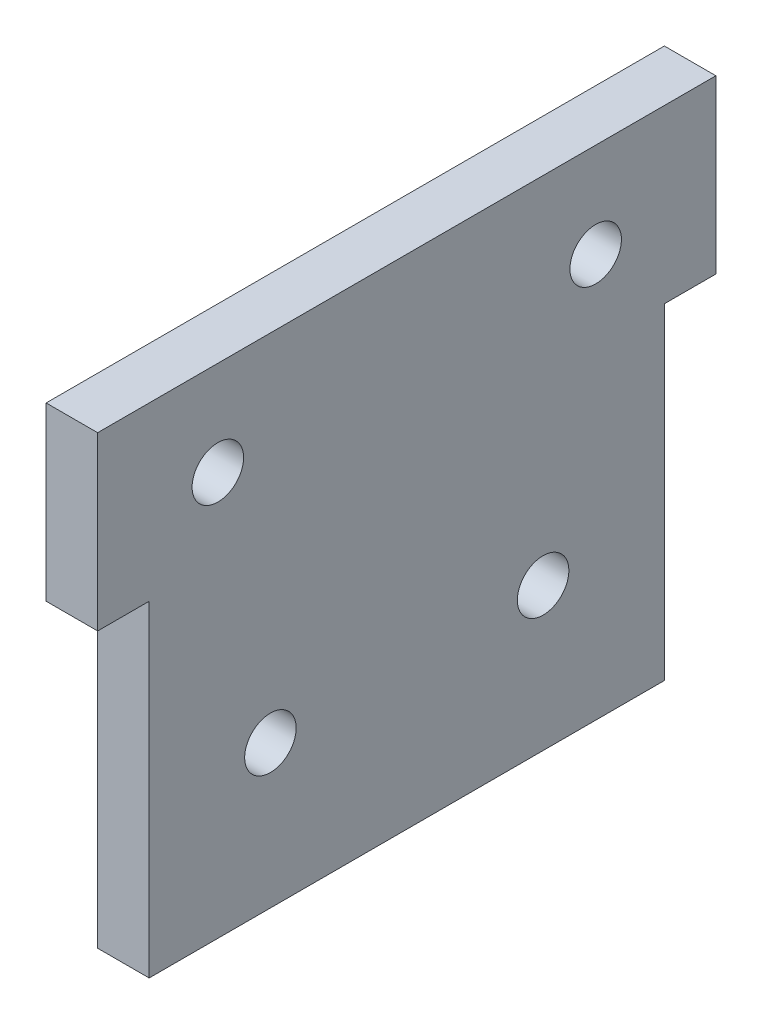
ISO-10303-21;
HEADER;
FILE_DESCRIPTION(('STEP AP214'),'2;1');
FILE_NAME('part.step','',(''),(''),'','','');
FILE_SCHEMA(('AUTOMOTIVE_DESIGN { 1 0 10303 214 1 1 1 1 }'));
ENDSEC;
DATA;
#1=APPLICATION_CONTEXT('core data for automotive mechanical design processes');
#2=APPLICATION_PROTOCOL_DEFINITION('international standard','automotive_design',2000,#1);
#3=PRODUCT_CONTEXT('',#1,'mechanical');
#4=PRODUCT('Part','Part','',(#3));
#5=PRODUCT_RELATED_PRODUCT_CATEGORY('part','',(#4));
#6=PRODUCT_DEFINITION_FORMATION('','',#4);
#7=PRODUCT_DEFINITION_CONTEXT('part definition',#1,'design');
#8=PRODUCT_DEFINITION('design','',#6,#7);
#9=PRODUCT_DEFINITION_SHAPE('','',#8);
#10=(LENGTH_UNIT() NAMED_UNIT(*) SI_UNIT(.MILLI.,.METRE.));
#11=(NAMED_UNIT(*) PLANE_ANGLE_UNIT() SI_UNIT($,.RADIAN.));
#12=(NAMED_UNIT(*) SI_UNIT($,.STERADIAN.) SOLID_ANGLE_UNIT());
#13=UNCERTAINTY_MEASURE_WITH_UNIT(LENGTH_MEASURE(1.E-05),#10,'distance_accuracy_value','');
#14=(GEOMETRIC_REPRESENTATION_CONTEXT(3) GLOBAL_UNCERTAINTY_ASSIGNED_CONTEXT((#13)) GLOBAL_UNIT_ASSIGNED_CONTEXT((#10,
#11,#12)) REPRESENTATION_CONTEXT('',''));
#15=CARTESIAN_POINT('',(0.,0.,0.));
#16=DIRECTION('',(0.,0.,1.));
#17=DIRECTION('',(1.,0.,0.));
#18=AXIS2_PLACEMENT_3D('',#15,#16,#17);
#19=CARTESIAN_POINT('',(3.,0.,0.));
#20=DIRECTION('',(-1.,0.,0.));
#21=DIRECTION('',(0.,0.,1.));
#22=AXIS2_PLACEMENT_3D('',#19,#20,#21);
#23=PLANE('',#22);
#24=DIRECTION('',(0.,0.,1.));
#25=VECTOR('',#24,1.);
#26=CARTESIAN_POINT('',(3.,32.2893221036416,-18.));
#27=LINE('',#26,#25);
#28=CARTESIAN_POINT('',(3.,32.2893221036416,-18.));
#29=VERTEX_POINT('',#28);
#30=CARTESIAN_POINT('',(3.,32.2893221036416,18.));
#31=VERTEX_POINT('',#30);
#32=EDGE_CURVE('E92',#29,#31,#27,.T.);
#33=ORIENTED_EDGE('',*,*,#32,.T.);
#34=DIRECTION('',(0.,-1.,0.));
#35=VECTOR('',#34,1.);
#36=CARTESIAN_POINT('',(3.,22.2893221036416,18.));
#37=LINE('',#36,#35);
#38=CARTESIAN_POINT('',(3.,22.2893221036416,18.));
#39=VERTEX_POINT('',#38);
#40=EDGE_CURVE('E177',#31,#39,#37,.T.);
#41=ORIENTED_EDGE('',*,*,#40,.T.);
#42=DIRECTION('',(0.,0.,-1.));
#43=VECTOR('',#42,1.);
#44=CARTESIAN_POINT('',(3.,22.2893221036416,18.));
#45=LINE('',#44,#43);
#46=CARTESIAN_POINT('',(3.,22.2893221036416,15.));
#47=VERTEX_POINT('',#46);
#48=EDGE_CURVE('E160',#39,#47,#45,.T.);
#49=ORIENTED_EDGE('',*,*,#48,.T.);
#50=DIRECTION('',(0.,-1.,0.));
#51=VECTOR('',#50,1.);
#52=CARTESIAN_POINT('',(3.,3.28932210364157,15.));
#53=LINE('',#52,#51);
#54=CARTESIAN_POINT('',(3.,3.28932210364157,15.));
#55=VERTEX_POINT('',#54);
#56=EDGE_CURVE('E173',#47,#55,#53,.T.);
#57=ORIENTED_EDGE('',*,*,#56,.T.);
#58=DIRECTION('',(0.,0.,-1.));
#59=VECTOR('',#58,1.);
#60=CARTESIAN_POINT('',(3.,3.28932210364158,-15.));
#61=LINE('',#60,#59);
#62=CARTESIAN_POINT('',(3.,3.28932210364158,-15.));
#63=VERTEX_POINT('',#62);
#64=EDGE_CURVE('E112',#55,#63,#61,.T.);
#65=ORIENTED_EDGE('',*,*,#64,.T.);
#66=DIRECTION('',(0.,1.,0.));
#67=VECTOR('',#66,1.);
#68=CARTESIAN_POINT('',(3.,3.28932210364158,-15.));
#69=LINE('',#68,#67);
#70=CARTESIAN_POINT('',(3.,22.2893221036416,-15.));
#71=VERTEX_POINT('',#70);
#72=EDGE_CURVE('E106',#63,#71,#69,.T.);
#73=ORIENTED_EDGE('',*,*,#72,.T.);
#74=DIRECTION('',(0.,0.,-1.));
#75=VECTOR('',#74,1.);
#76=CARTESIAN_POINT('',(3.,22.2893221036416,-18.));
#77=LINE('',#76,#75);
#78=CARTESIAN_POINT('',(3.,22.2893221036416,-18.));
#79=VERTEX_POINT('',#78);
#80=EDGE_CURVE('E110',#71,#79,#77,.T.);
#81=ORIENTED_EDGE('',*,*,#80,.T.);
#82=DIRECTION('',(0.,1.,0.));
#83=VECTOR('',#82,1.);
#84=CARTESIAN_POINT('',(3.,22.2893221036416,-18.));
#85=LINE('',#84,#83);
#86=EDGE_CURVE('E50',#79,#29,#85,.T.);
#87=ORIENTED_EDGE('',*,*,#86,.T.);
#88=EDGE_LOOP('',(#33,#41,#49,#57,#65,#73,#81,#87));
#89=FACE_BOUND('',#88,.T.);
#90=CARTESIAN_POINT('',(3.,11.6193221036416,-7.94));
#91=DIRECTION('',(1.,0.,0.));
#92=DIRECTION('',(0.,0.,-1.));
#93=AXIS2_PLACEMENT_3D('',#90,#91,#92);
#94=CIRCLE('',#93,1.5);
#95=CARTESIAN_POINT('',(3.,11.6193221036416,-9.44));
#96=VERTEX_POINT('',#95);
#97=EDGE_CURVE('E132',#96,#96,#94,.T.);
#98=ORIENTED_EDGE('',*,*,#97,.F.);
#99=EDGE_LOOP('',(#98));
#100=FACE_BOUND('',#99,.T.);
#101=CARTESIAN_POINT('',(3.,11.6193221036416,7.93999999999999));
#102=DIRECTION('',(1.,0.,0.));
#103=DIRECTION('',(0.,0.,1.));
#104=AXIS2_PLACEMENT_3D('',#101,#102,#103);
#105=CIRCLE('',#104,1.5);
#106=CARTESIAN_POINT('',(3.,11.6193221036416,9.43999999999999));
#107=VERTEX_POINT('',#106);
#108=EDGE_CURVE('E183',#107,#107,#105,.T.);
#109=ORIENTED_EDGE('',*,*,#108,.F.);
#110=EDGE_LOOP('',(#109));
#111=FACE_BOUND('',#110,.T.);
#112=CARTESIAN_POINT('',(3.,26.7893221036416,-11.));
#113=DIRECTION('',(1.,0.,0.));
#114=DIRECTION('',(0.,0.,-1.));
#115=AXIS2_PLACEMENT_3D('',#112,#113,#114);
#116=CIRCLE('',#115,1.5);
#117=CARTESIAN_POINT('',(3.,26.7893221036416,-12.5));
#118=VERTEX_POINT('',#117);
#119=EDGE_CURVE('E189',#118,#118,#116,.T.);
#120=ORIENTED_EDGE('',*,*,#119,.F.);
#121=EDGE_LOOP('',(#120));
#122=FACE_BOUND('',#121,.T.);
#123=CARTESIAN_POINT('',(3.,26.7893221036416,11.));
#124=DIRECTION('',(1.,0.,0.));
#125=DIRECTION('',(0.,0.,1.));
#126=AXIS2_PLACEMENT_3D('',#123,#124,#125);
#127=CIRCLE('',#126,1.5);
#128=CARTESIAN_POINT('',(3.,26.7893221036416,12.5));
#129=VERTEX_POINT('',#128);
#130=EDGE_CURVE('E195',#129,#129,#127,.T.);
#131=ORIENTED_EDGE('',*,*,#130,.F.);
#132=EDGE_LOOP('',(#131));
#133=FACE_BOUND('',#132,.T.);
#134=ADVANCED_FACE('F33',(#89,#100,#111,#122,#133),#23,.F.);
#135=CARTESIAN_POINT('',(0.,0.,0.));
#136=DIRECTION('',(-1.,0.,0.));
#137=DIRECTION('',(0.,0.,1.));
#138=AXIS2_PLACEMENT_3D('',#135,#136,#137);
#139=PLANE('',#138);
#140=CARTESIAN_POINT('',(0.,26.7893221036416,-11.));
#141=DIRECTION('',(1.,0.,0.));
#142=DIRECTION('',(0.,0.,-1.));
#143=AXIS2_PLACEMENT_3D('',#140,#141,#142);
#144=CIRCLE('',#143,1.5);
#145=CARTESIAN_POINT('',(0.,26.7893221036416,-12.5));
#146=VERTEX_POINT('',#145);
#147=EDGE_CURVE('E192',#146,#146,#144,.T.);
#148=ORIENTED_EDGE('',*,*,#147,.T.);
#149=EDGE_LOOP('',(#148));
#150=FACE_BOUND('',#149,.T.);
#151=CARTESIAN_POINT('',(0.,11.6193221036416,-7.94));
#152=DIRECTION('',(1.,0.,0.));
#153=DIRECTION('',(0.,0.,-1.));
#154=AXIS2_PLACEMENT_3D('',#151,#152,#153);
#155=CIRCLE('',#154,1.5);
#156=CARTESIAN_POINT('',(0.,11.6193221036416,-9.44));
#157=VERTEX_POINT('',#156);
#158=EDGE_CURVE('E180',#157,#157,#155,.T.);
#159=ORIENTED_EDGE('',*,*,#158,.T.);
#160=EDGE_LOOP('',(#159));
#161=FACE_BOUND('',#160,.T.);
#162=DIRECTION('',(0.,0.,1.));
#163=VECTOR('',#162,1.);
#164=CARTESIAN_POINT('',(0.,32.2893221036416,18.));
#165=LINE('',#164,#163);
#166=CARTESIAN_POINT('',(0.,32.2893221036416,-18.));
#167=VERTEX_POINT('',#166);
#168=CARTESIAN_POINT('',(0.,32.2893221036416,18.));
#169=VERTEX_POINT('',#168);
#170=EDGE_CURVE('E86',#167,#169,#165,.T.);
#171=ORIENTED_EDGE('',*,*,#170,.F.);
#172=DIRECTION('',(0.,1.,0.));
#173=VECTOR('',#172,1.);
#174=CARTESIAN_POINT('',(0.,22.2893221036416,-18.));
#175=LINE('',#174,#173);
#176=CARTESIAN_POINT('',(0.,22.2893221036416,-18.));
#177=VERTEX_POINT('',#176);
#178=EDGE_CURVE('E142',#177,#167,#175,.T.);
#179=ORIENTED_EDGE('',*,*,#178,.F.);
#180=DIRECTION('',(0.,0.,-1.));
#181=VECTOR('',#180,1.);
#182=CARTESIAN_POINT('',(0.,22.2893221036416,-18.));
#183=LINE('',#182,#181);
#184=CARTESIAN_POINT('',(0.,22.2893221036416,-15.));
#185=VERTEX_POINT('',#184);
#186=EDGE_CURVE('E79',#185,#177,#183,.T.);
#187=ORIENTED_EDGE('',*,*,#186,.F.);
#188=DIRECTION('',(0.,1.,0.));
#189=VECTOR('',#188,1.);
#190=CARTESIAN_POINT('',(0.,3.28932210364158,-15.));
#191=LINE('',#190,#189);
#192=CARTESIAN_POINT('',(0.,3.28932210364158,-15.));
#193=VERTEX_POINT('',#192);
#194=EDGE_CURVE('E120',#193,#185,#191,.T.);
#195=ORIENTED_EDGE('',*,*,#194,.F.);
#196=DIRECTION('',(0.,0.,-1.));
#197=VECTOR('',#196,1.);
#198=CARTESIAN_POINT('',(0.,3.28932210364158,-15.));
#199=LINE('',#198,#197);
#200=CARTESIAN_POINT('',(0.,3.28932210364157,15.));
#201=VERTEX_POINT('',#200);
#202=EDGE_CURVE('E138',#201,#193,#199,.T.);
#203=ORIENTED_EDGE('',*,*,#202,.F.);
#204=DIRECTION('',(0.,-1.,0.));
#205=VECTOR('',#204,1.);
#206=CARTESIAN_POINT('',(0.,3.28932210364157,15.));
#207=LINE('',#206,#205);
#208=CARTESIAN_POINT('',(0.,22.2893221036416,15.));
#209=VERTEX_POINT('',#208);
#210=EDGE_CURVE('E136',#209,#201,#207,.T.);
#211=ORIENTED_EDGE('',*,*,#210,.F.);
#212=DIRECTION('',(0.,0.,-1.));
#213=VECTOR('',#212,1.);
#214=CARTESIAN_POINT('',(0.,22.2893221036416,18.));
#215=LINE('',#214,#213);
#216=CARTESIAN_POINT('',(0.,22.2893221036416,18.));
#217=VERTEX_POINT('',#216);
#218=EDGE_CURVE('E134',#217,#209,#215,.T.);
#219=ORIENTED_EDGE('',*,*,#218,.F.);
#220=DIRECTION('',(0.,-1.,0.));
#221=VECTOR('',#220,1.);
#222=CARTESIAN_POINT('',(0.,22.2893221036416,18.));
#223=LINE('',#222,#221);
#224=EDGE_CURVE('E131',#169,#217,#223,.T.);
#225=ORIENTED_EDGE('',*,*,#224,.F.);
#226=EDGE_LOOP('',(#171,#179,#187,#195,#203,#211,#219,#225));
#227=FACE_BOUND('',#226,.T.);
#228=CARTESIAN_POINT('',(0.,11.6193221036416,7.93999999999999));
#229=DIRECTION('',(1.,0.,0.));
#230=DIRECTION('',(0.,0.,1.));
#231=AXIS2_PLACEMENT_3D('',#228,#229,#230);
#232=CIRCLE('',#231,1.5);
#233=CARTESIAN_POINT('',(0.,11.6193221036416,9.43999999999999));
#234=VERTEX_POINT('',#233);
#235=EDGE_CURVE('E186',#234,#234,#232,.T.);
#236=ORIENTED_EDGE('',*,*,#235,.T.);
#237=EDGE_LOOP('',(#236));
#238=FACE_BOUND('',#237,.T.);
#239=CARTESIAN_POINT('',(0.,26.7893221036416,11.));
#240=DIRECTION('',(1.,0.,0.));
#241=DIRECTION('',(0.,0.,1.));
#242=AXIS2_PLACEMENT_3D('',#239,#240,#241);
#243=CIRCLE('',#242,1.5);
#244=CARTESIAN_POINT('',(0.,26.7893221036416,12.5));
#245=VERTEX_POINT('',#244);
#246=EDGE_CURVE('E198',#245,#245,#243,.T.);
#247=ORIENTED_EDGE('',*,*,#246,.T.);
#248=EDGE_LOOP('',(#247));
#249=FACE_BOUND('',#248,.T.);
#250=ADVANCED_FACE('F164',(#150,#161,#227,#238,#249),#139,.T.);
#251=CARTESIAN_POINT('',(3.,32.2893221036416,18.));
#252=DIRECTION('',(0.,-1.,0.));
#253=DIRECTION('',(0.,0.,-1.));
#254=AXIS2_PLACEMENT_3D('',#251,#252,#253);
#255=PLANE('',#254);
#256=ORIENTED_EDGE('',*,*,#170,.T.);
#257=DIRECTION('',(-1.,0.,0.));
#258=VECTOR('',#257,1.);
#259=CARTESIAN_POINT('',(3.,32.2893221036416,18.));
#260=LINE('',#259,#258);
#261=EDGE_CURVE('E11',#31,#169,#260,.T.);
#262=ORIENTED_EDGE('',*,*,#261,.F.);
#263=ORIENTED_EDGE('',*,*,#32,.F.);
#264=DIRECTION('',(-1.,0.,0.));
#265=VECTOR('',#264,1.);
#266=CARTESIAN_POINT('',(3.,32.2893221036416,-18.));
#267=LINE('',#266,#265);
#268=EDGE_CURVE('E126',#29,#167,#267,.T.);
#269=ORIENTED_EDGE('',*,*,#268,.T.);
#270=EDGE_LOOP('',(#256,#262,#263,#269));
#271=FACE_BOUND('',#270,.T.);
#272=ADVANCED_FACE('F35',(#271),#255,.F.);
#273=CARTESIAN_POINT('',(3.,22.2893221036416,18.));
#274=DIRECTION('',(0.,0.,-1.));
#275=DIRECTION('',(-1.,0.,0.));
#276=AXIS2_PLACEMENT_3D('',#273,#274,#275);
#277=PLANE('',#276);
#278=ORIENTED_EDGE('',*,*,#224,.T.);
#279=DIRECTION('',(-1.,0.,0.));
#280=VECTOR('',#279,1.);
#281=CARTESIAN_POINT('',(3.,22.2893221036416,18.));
#282=LINE('',#281,#280);
#283=EDGE_CURVE('E42',#39,#217,#282,.T.);
#284=ORIENTED_EDGE('',*,*,#283,.F.);
#285=ORIENTED_EDGE('',*,*,#40,.F.);
#286=ORIENTED_EDGE('',*,*,#261,.T.);
#287=EDGE_LOOP('',(#278,#284,#285,#286));
#288=FACE_BOUND('',#287,.T.);
#289=ADVANCED_FACE('F231',(#288),#277,.F.);
#290=CARTESIAN_POINT('',(3.,22.2893221036416,18.));
#291=DIRECTION('',(0.,1.,0.));
#292=DIRECTION('',(0.,0.,1.));
#293=AXIS2_PLACEMENT_3D('',#290,#291,#292);
#294=PLANE('',#293);
#295=ORIENTED_EDGE('',*,*,#218,.T.);
#296=DIRECTION('',(-1.,0.,0.));
#297=VECTOR('',#296,1.);
#298=CARTESIAN_POINT('',(3.,22.2893221036416,15.));
#299=LINE('',#298,#297);
#300=EDGE_CURVE('E151',#47,#209,#299,.T.);
#301=ORIENTED_EDGE('',*,*,#300,.F.);
#302=ORIENTED_EDGE('',*,*,#48,.F.);
#303=ORIENTED_EDGE('',*,*,#283,.T.);
#304=EDGE_LOOP('',(#295,#301,#302,#303));
#305=FACE_BOUND('',#304,.T.);
#306=ADVANCED_FACE('F158',(#305),#294,.F.);
#307=CARTESIAN_POINT('',(3.,3.28932210364157,15.));
#308=DIRECTION('',(0.,0.,-1.));
#309=DIRECTION('',(0.,1.,0.));
#310=AXIS2_PLACEMENT_3D('',#307,#308,#309);
#311=PLANE('',#310);
#312=ORIENTED_EDGE('',*,*,#210,.T.);
#313=DIRECTION('',(-1.,0.,0.));
#314=VECTOR('',#313,1.);
#315=CARTESIAN_POINT('',(3.,3.28932210364157,15.));
#316=LINE('',#315,#314);
#317=EDGE_CURVE('E148',#55,#201,#316,.T.);
#318=ORIENTED_EDGE('',*,*,#317,.F.);
#319=ORIENTED_EDGE('',*,*,#56,.F.);
#320=ORIENTED_EDGE('',*,*,#300,.T.);
#321=EDGE_LOOP('',(#312,#318,#319,#320));
#322=FACE_BOUND('',#321,.T.);
#323=ADVANCED_FACE('F169',(#322),#311,.F.);
#324=CARTESIAN_POINT('',(3.,3.28932210364158,-15.));
#325=DIRECTION('',(0.,1.,0.));
#326=DIRECTION('',(0.,0.,1.));
#327=AXIS2_PLACEMENT_3D('',#324,#325,#326);
#328=PLANE('',#327);
#329=ORIENTED_EDGE('',*,*,#202,.T.);
#330=DIRECTION('',(-1.,0.,0.));
#331=VECTOR('',#330,1.);
#332=CARTESIAN_POINT('',(3.,3.28932210364158,-15.));
#333=LINE('',#332,#331);
#334=EDGE_CURVE('E121',#63,#193,#333,.T.);
#335=ORIENTED_EDGE('',*,*,#334,.F.);
#336=ORIENTED_EDGE('',*,*,#64,.F.);
#337=ORIENTED_EDGE('',*,*,#317,.T.);
#338=EDGE_LOOP('',(#329,#335,#336,#337));
#339=FACE_BOUND('',#338,.T.);
#340=ADVANCED_FACE('F172',(#339),#328,.F.);
#341=CARTESIAN_POINT('',(3.,3.28932210364158,-15.));
#342=DIRECTION('',(0.,0.,1.));
#343=DIRECTION('',(1.,0.,0.));
#344=AXIS2_PLACEMENT_3D('',#341,#342,#343);
#345=PLANE('',#344);
#346=ORIENTED_EDGE('',*,*,#194,.T.);
#347=DIRECTION('',(-1.,0.,0.));
#348=VECTOR('',#347,1.);
#349=CARTESIAN_POINT('',(3.,22.2893221036416,-15.));
#350=LINE('',#349,#348);
#351=EDGE_CURVE('E117',#71,#185,#350,.T.);
#352=ORIENTED_EDGE('',*,*,#351,.F.);
#353=ORIENTED_EDGE('',*,*,#72,.F.);
#354=ORIENTED_EDGE('',*,*,#334,.T.);
#355=EDGE_LOOP('',(#346,#352,#353,#354));
#356=FACE_BOUND('',#355,.T.);
#357=ADVANCED_FACE('F118',(#356),#345,.F.);
#358=CARTESIAN_POINT('',(3.,22.2893221036416,-18.));
#359=DIRECTION('',(0.,1.,0.));
#360=DIRECTION('',(0.,0.,1.));
#361=AXIS2_PLACEMENT_3D('',#358,#359,#360);
#362=PLANE('',#361);
#363=ORIENTED_EDGE('',*,*,#186,.T.);
#364=DIRECTION('',(-1.,0.,0.));
#365=VECTOR('',#364,1.);
#366=CARTESIAN_POINT('',(3.,22.2893221036416,-18.));
#367=LINE('',#366,#365);
#368=EDGE_CURVE('E122',#79,#177,#367,.T.);
#369=ORIENTED_EDGE('',*,*,#368,.F.);
#370=ORIENTED_EDGE('',*,*,#80,.F.);
#371=ORIENTED_EDGE('',*,*,#351,.T.);
#372=EDGE_LOOP('',(#363,#369,#370,#371));
#373=FACE_BOUND('',#372,.T.);
#374=ADVANCED_FACE('F124',(#373),#362,.F.);
#375=CARTESIAN_POINT('',(3.,22.2893221036416,-18.));
#376=DIRECTION('',(0.,0.,1.));
#377=DIRECTION('',(1.,0.,0.));
#378=AXIS2_PLACEMENT_3D('',#375,#376,#377);
#379=PLANE('',#378);
#380=ORIENTED_EDGE('',*,*,#178,.T.);
#381=ORIENTED_EDGE('',*,*,#268,.F.);
#382=ORIENTED_EDGE('',*,*,#86,.F.);
#383=ORIENTED_EDGE('',*,*,#368,.T.);
#384=EDGE_LOOP('',(#380,#381,#382,#383));
#385=FACE_BOUND('',#384,.T.);
#386=ADVANCED_FACE('F218',(#385),#379,.F.);
#387=CARTESIAN_POINT('',(3.,11.6193221036416,-7.94));
#388=DIRECTION('',(-1.,0.,0.));
#389=DIRECTION('',(0.,0.,1.));
#390=AXIS2_PLACEMENT_3D('',#387,#388,#389);
#391=CYLINDRICAL_SURFACE('',#390,1.5);
#392=ORIENTED_EDGE('',*,*,#97,.T.);
#393=EDGE_LOOP('',(#392));
#394=FACE_BOUND('',#393,.T.);
#395=ORIENTED_EDGE('',*,*,#158,.F.);
#396=EDGE_LOOP('',(#395));
#397=FACE_BOUND('',#396,.T.);
#398=ADVANCED_FACE('F215',(#394,#397),#391,.F.);
#399=CARTESIAN_POINT('',(3.,11.6193221036416,7.93999999999999));
#400=DIRECTION('',(-1.,0.,0.));
#401=DIRECTION('',(0.,0.,1.));
#402=AXIS2_PLACEMENT_3D('',#399,#400,#401);
#403=CYLINDRICAL_SURFACE('',#402,1.5);
#404=ORIENTED_EDGE('',*,*,#108,.T.);
#405=EDGE_LOOP('',(#404));
#406=FACE_BOUND('',#405,.T.);
#407=ORIENTED_EDGE('',*,*,#235,.F.);
#408=EDGE_LOOP('',(#407));
#409=FACE_BOUND('',#408,.T.);
#410=ADVANCED_FACE('F299',(#406,#409),#403,.F.);
#411=CARTESIAN_POINT('',(3.,26.7893221036416,-11.));
#412=DIRECTION('',(-1.,0.,0.));
#413=DIRECTION('',(0.,0.,1.));
#414=AXIS2_PLACEMENT_3D('',#411,#412,#413);
#415=CYLINDRICAL_SURFACE('',#414,1.5);
#416=ORIENTED_EDGE('',*,*,#119,.T.);
#417=EDGE_LOOP('',(#416));
#418=FACE_BOUND('',#417,.T.);
#419=ORIENTED_EDGE('',*,*,#147,.F.);
#420=EDGE_LOOP('',(#419));
#421=FACE_BOUND('',#420,.T.);
#422=ADVANCED_FACE('F307',(#418,#421),#415,.F.);
#423=CARTESIAN_POINT('',(3.,26.7893221036416,11.));
#424=DIRECTION('',(-1.,0.,0.));
#425=DIRECTION('',(0.,0.,1.));
#426=AXIS2_PLACEMENT_3D('',#423,#424,#425);
#427=CYLINDRICAL_SURFACE('',#426,1.5);
#428=ORIENTED_EDGE('',*,*,#130,.T.);
#429=EDGE_LOOP('',(#428));
#430=FACE_BOUND('',#429,.T.);
#431=ORIENTED_EDGE('',*,*,#246,.F.);
#432=EDGE_LOOP('',(#431));
#433=FACE_BOUND('',#432,.T.);
#434=ADVANCED_FACE('F204',(#430,#433),#427,.F.);
#435=CLOSED_SHELL('',(#134,#250,#272,#289,#306,#323,#340,#357,#374,#386,#398,#410,#422,#434));
#436=MANIFOLD_SOLID_BREP('B2',#435);
#437=ADVANCED_BREP_SHAPE_REPRESENTATION('',(#18,#436),#14);
#438=SHAPE_DEFINITION_REPRESENTATION(#9,#437);
ENDSEC;
END-ISO-10303-21;
